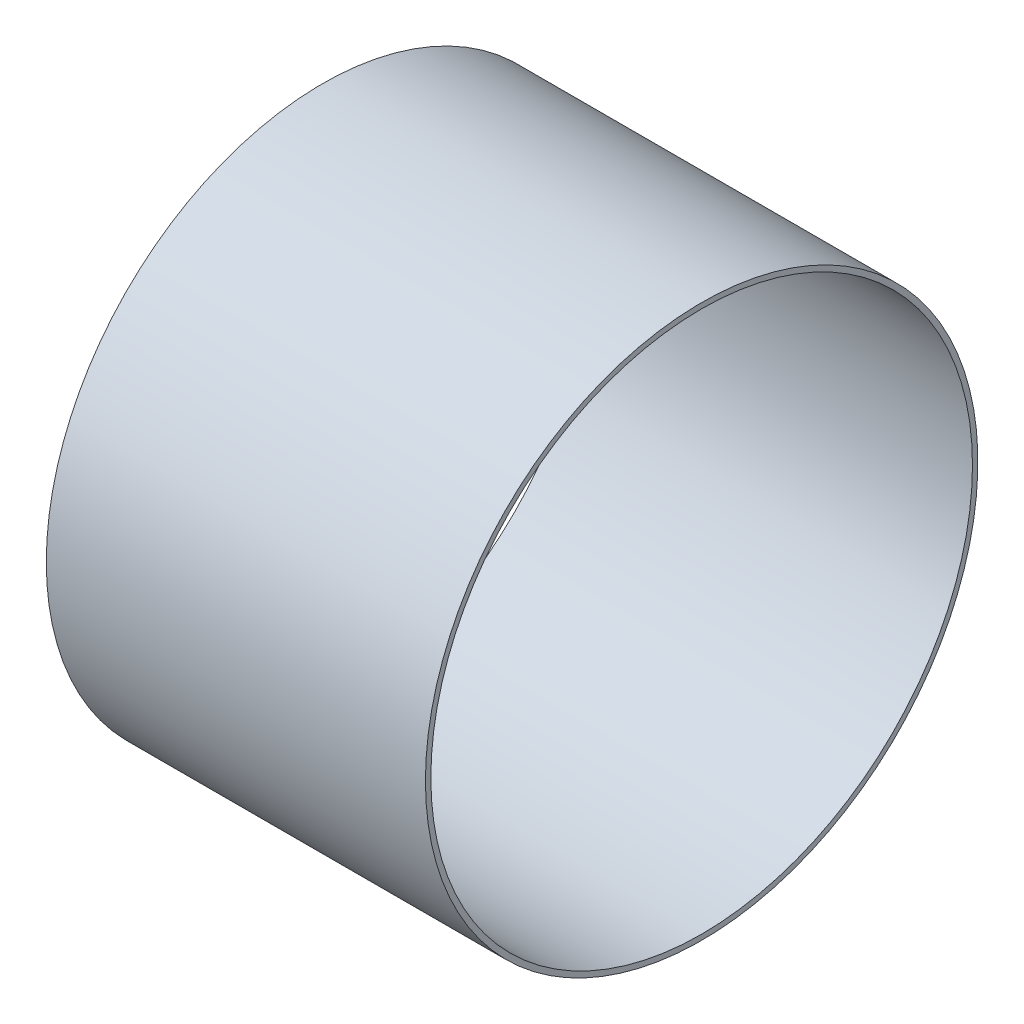
ISO-10303-21;
HEADER;
FILE_DESCRIPTION(('STEP AP214'),'2;1');
FILE_NAME('part.step','',(''),(''),'','','');
FILE_SCHEMA(('AUTOMOTIVE_DESIGN { 1 0 10303 214 1 1 1 1 }'));
ENDSEC;
DATA;
#1=APPLICATION_CONTEXT('core data for automotive mechanical design processes');
#2=APPLICATION_PROTOCOL_DEFINITION('international standard','automotive_design',2000,#1);
#3=PRODUCT_CONTEXT('',#1,'mechanical');
#4=PRODUCT('Part','Part','',(#3));
#5=PRODUCT_RELATED_PRODUCT_CATEGORY('part','',(#4));
#6=PRODUCT_DEFINITION_FORMATION('','',#4);
#7=PRODUCT_DEFINITION_CONTEXT('part definition',#1,'design');
#8=PRODUCT_DEFINITION('design','',#6,#7);
#9=PRODUCT_DEFINITION_SHAPE('','',#8);
#10=(LENGTH_UNIT() NAMED_UNIT(*) SI_UNIT(.MILLI.,.METRE.));
#11=(NAMED_UNIT(*) PLANE_ANGLE_UNIT() SI_UNIT($,.RADIAN.));
#12=(NAMED_UNIT(*) SI_UNIT($,.STERADIAN.) SOLID_ANGLE_UNIT());
#13=UNCERTAINTY_MEASURE_WITH_UNIT(LENGTH_MEASURE(1.E-05),#10,'distance_accuracy_value','');
#14=(GEOMETRIC_REPRESENTATION_CONTEXT(3) GLOBAL_UNCERTAINTY_ASSIGNED_CONTEXT((#13)) GLOBAL_UNIT_ASSIGNED_CONTEXT((#10,
#11,#12)) REPRESENTATION_CONTEXT('',''));
#15=CARTESIAN_POINT('',(0.,0.,0.));
#16=DIRECTION('',(0.,0.,1.));
#17=DIRECTION('',(1.,0.,0.));
#18=AXIS2_PLACEMENT_3D('',#15,#16,#17);
#19=CARTESIAN_POINT('',(-70.,102.,0.));
#20=DIRECTION('',(1.,0.,0.));
#21=DIRECTION('',(0.,0.,-1.));
#22=AXIS2_PLACEMENT_3D('',#19,#20,#21);
#23=PLANE('',#22);
#24=CARTESIAN_POINT('',(-70.,0.,0.));
#25=DIRECTION('',(-1.,0.,0.));
#26=DIRECTION('',(0.,0.,1.));
#27=AXIS2_PLACEMENT_3D('',#24,#25,#26);
#28=CIRCLE('',#27,100.);
#29=CARTESIAN_POINT('',(-70.,0.,100.));
#30=VERTEX_POINT('',#29);
#31=EDGE_CURVE('E11',#30,#30,#28,.T.);
#32=ORIENTED_EDGE('',*,*,#31,.F.);
#33=EDGE_LOOP('',(#32));
#34=FACE_BOUND('',#33,.T.);
#35=CARTESIAN_POINT('',(-70.,0.,0.));
#36=DIRECTION('',(-1.,0.,0.));
#37=DIRECTION('',(0.,0.,1.));
#38=AXIS2_PLACEMENT_3D('',#35,#36,#37);
#39=CIRCLE('',#38,102.);
#40=CARTESIAN_POINT('',(-70.,0.,102.));
#41=VERTEX_POINT('',#40);
#42=EDGE_CURVE('E68',#41,#41,#39,.T.);
#43=ORIENTED_EDGE('',*,*,#42,.T.);
#44=EDGE_LOOP('',(#43));
#45=FACE_BOUND('',#44,.T.);
#46=ADVANCED_FACE('F46',(#34,#45),#23,.F.);
#47=CARTESIAN_POINT('',(0.,0.,0.));
#48=DIRECTION('',(-1.,0.,0.));
#49=DIRECTION('',(0.,0.,1.));
#50=AXIS2_PLACEMENT_3D('',#47,#48,#49);
#51=CYLINDRICAL_SURFACE('',#50,100.);
#52=CARTESIAN_POINT('',(70.,0.,0.));
#53=DIRECTION('',(-1.,0.,0.));
#54=DIRECTION('',(0.,0.,1.));
#55=AXIS2_PLACEMENT_3D('',#52,#53,#54);
#56=CIRCLE('',#55,100.);
#57=CARTESIAN_POINT('',(70.,0.,100.));
#58=VERTEX_POINT('',#57);
#59=EDGE_CURVE('E55',#58,#58,#56,.T.);
#60=ORIENTED_EDGE('',*,*,#59,.F.);
#61=EDGE_LOOP('',(#60));
#62=FACE_BOUND('',#61,.T.);
#63=ORIENTED_EDGE('',*,*,#31,.T.);
#64=EDGE_LOOP('',(#63));
#65=FACE_BOUND('',#64,.T.);
#66=ADVANCED_FACE('F88',(#62,#65),#51,.F.);
#67=CARTESIAN_POINT('',(70.,102.,0.));
#68=DIRECTION('',(-1.,0.,0.));
#69=DIRECTION('',(0.,0.,1.));
#70=AXIS2_PLACEMENT_3D('',#67,#68,#69);
#71=PLANE('',#70);
#72=CARTESIAN_POINT('',(70.,0.,0.));
#73=DIRECTION('',(-1.,0.,0.));
#74=DIRECTION('',(0.,0.,1.));
#75=AXIS2_PLACEMENT_3D('',#72,#73,#74);
#76=CIRCLE('',#75,102.);
#77=CARTESIAN_POINT('',(70.,0.,102.));
#78=VERTEX_POINT('',#77);
#79=EDGE_CURVE('E62',#78,#78,#76,.T.);
#80=ORIENTED_EDGE('',*,*,#79,.F.);
#81=EDGE_LOOP('',(#80));
#82=FACE_BOUND('',#81,.T.);
#83=ORIENTED_EDGE('',*,*,#59,.T.);
#84=EDGE_LOOP('',(#83));
#85=FACE_BOUND('',#84,.T.);
#86=ADVANCED_FACE('F83',(#82,#85),#71,.F.);
#87=CARTESIAN_POINT('',(0.,0.,0.));
#88=DIRECTION('',(-1.,0.,0.));
#89=DIRECTION('',(0.,0.,1.));
#90=AXIS2_PLACEMENT_3D('',#87,#88,#89);
#91=CYLINDRICAL_SURFACE('',#90,102.);
#92=ORIENTED_EDGE('',*,*,#42,.F.);
#93=EDGE_LOOP('',(#92));
#94=FACE_BOUND('',#93,.T.);
#95=ORIENTED_EDGE('',*,*,#79,.T.);
#96=EDGE_LOOP('',(#95));
#97=FACE_BOUND('',#96,.T.);
#98=ADVANCED_FACE('F80',(#94,#97),#91,.T.);
#99=CLOSED_SHELL('',(#46,#66,#86,#98));
#100=MANIFOLD_SOLID_BREP('B2',#99);
#101=ADVANCED_BREP_SHAPE_REPRESENTATION('',(#18,#100),#14);
#102=SHAPE_DEFINITION_REPRESENTATION(#9,#101);
ENDSEC;
END-ISO-10303-21;
